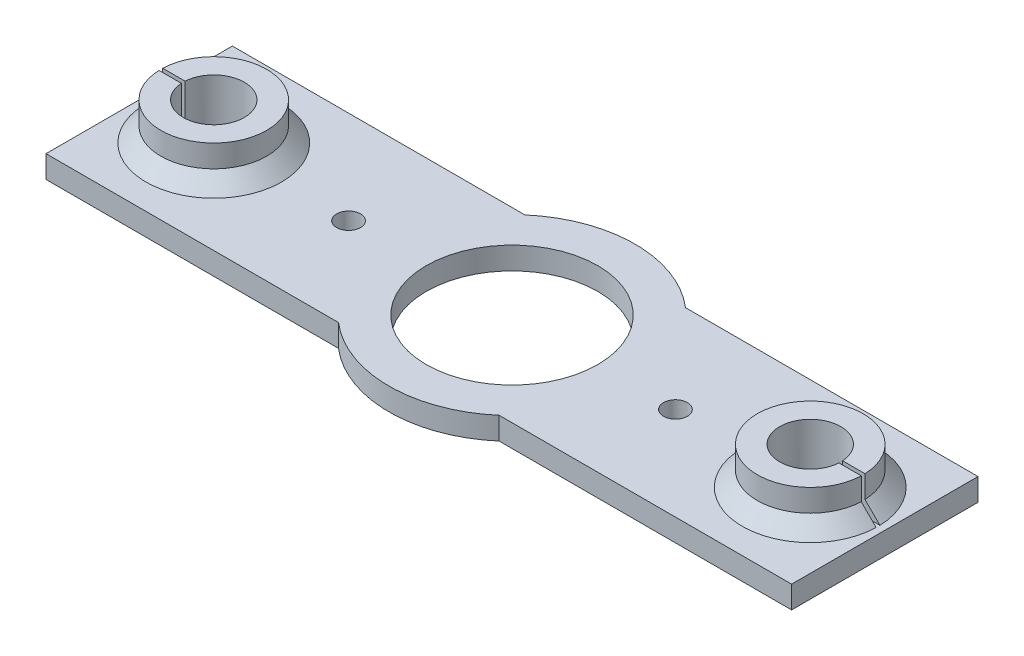
ISO-10303-21;
HEADER;
FILE_DESCRIPTION(('STEP AP214'),'2;1');
FILE_NAME('part.step','',(''),(''),'','','');
FILE_SCHEMA(('AUTOMOTIVE_DESIGN { 1 0 10303 214 1 1 1 1 }'));
ENDSEC;
DATA;
#1=APPLICATION_CONTEXT('core data for automotive mechanical design processes');
#2=APPLICATION_PROTOCOL_DEFINITION('international standard','automotive_design',2000,#1);
#3=PRODUCT_CONTEXT('',#1,'mechanical');
#4=PRODUCT('Part','Part','',(#3));
#5=PRODUCT_RELATED_PRODUCT_CATEGORY('part','',(#4));
#6=PRODUCT_DEFINITION_FORMATION('','',#4);
#7=PRODUCT_DEFINITION_CONTEXT('part definition',#1,'design');
#8=PRODUCT_DEFINITION('design','',#6,#7);
#9=PRODUCT_DEFINITION_SHAPE('','',#8);
#10=(LENGTH_UNIT() NAMED_UNIT(*) SI_UNIT(.MILLI.,.METRE.));
#11=(NAMED_UNIT(*) PLANE_ANGLE_UNIT() SI_UNIT($,.RADIAN.));
#12=(NAMED_UNIT(*) SI_UNIT($,.STERADIAN.) SOLID_ANGLE_UNIT());
#13=UNCERTAINTY_MEASURE_WITH_UNIT(LENGTH_MEASURE(1.E-05),#10,'distance_accuracy_value','');
#14=(GEOMETRIC_REPRESENTATION_CONTEXT(3) GLOBAL_UNCERTAINTY_ASSIGNED_CONTEXT((#13)) GLOBAL_UNIT_ASSIGNED_CONTEXT((#10,
#11,#12)) REPRESENTATION_CONTEXT('',''));
#15=CARTESIAN_POINT('',(0.,0.,0.));
#16=DIRECTION('',(0.,0.,1.));
#17=DIRECTION('',(1.,0.,0.));
#18=AXIS2_PLACEMENT_3D('',#15,#16,#17);
#19=CARTESIAN_POINT('',(0.,3.,12.5));
#20=DIRECTION('',(0.,0.,1.));
#21=DIRECTION('',(1.,0.,0.));
#22=AXIS2_PLACEMENT_3D('',#19,#20,#21);
#23=PLANE('',#22);
#24=DIRECTION('',(-1.,0.,0.));
#25=VECTOR('',#24,1.);
#26=CARTESIAN_POINT('',(0.,0.,12.5));
#27=LINE('',#26,#25);
#28=CARTESIAN_POINT('',(-10.770329614269,0.,12.5));
#29=VERTEX_POINT('',#28);
#30=CARTESIAN_POINT('',(-50.,0.,12.5));
#31=VERTEX_POINT('',#30);
#32=EDGE_CURVE('E228',#29,#31,#27,.T.);
#33=ORIENTED_EDGE('',*,*,#32,.F.);
#34=DIRECTION('',(0.,-1.,0.));
#35=VECTOR('',#34,1.);
#36=CARTESIAN_POINT('',(-10.770329614269,3.,12.5));
#37=LINE('',#36,#35);
#38=CARTESIAN_POINT('',(-10.770329614269,3.,12.5));
#39=VERTEX_POINT('',#38);
#40=EDGE_CURVE('E315',#39,#29,#37,.T.);
#41=ORIENTED_EDGE('',*,*,#40,.F.);
#42=DIRECTION('',(-1.,0.,0.));
#43=VECTOR('',#42,1.);
#44=CARTESIAN_POINT('',(0.,3.,12.5));
#45=LINE('',#44,#43);
#46=CARTESIAN_POINT('',(-50.,3.,12.5));
#47=VERTEX_POINT('',#46);
#48=EDGE_CURVE('E229',#39,#47,#45,.T.);
#49=ORIENTED_EDGE('',*,*,#48,.T.);
#50=DIRECTION('',(0.,-1.,0.));
#51=VECTOR('',#50,1.);
#52=CARTESIAN_POINT('',(-50.,3.,12.5));
#53=LINE('',#52,#51);
#54=EDGE_CURVE('E264',#47,#31,#53,.T.);
#55=ORIENTED_EDGE('',*,*,#54,.T.);
#56=EDGE_LOOP('',(#33,#41,#49,#55));
#57=FACE_BOUND('',#56,.T.);
#58=ADVANCED_FACE('F35',(#57),#23,.T.);
#59=CARTESIAN_POINT('',(0.,3.,0.));
#60=DIRECTION('',(0.,-1.,0.));
#61=DIRECTION('',(0.,0.,-1.));
#62=AXIS2_PLACEMENT_3D('',#59,#60,#61);
#63=CYLINDRICAL_SURFACE('',#62,16.5);
#64=CARTESIAN_POINT('',(0.,0.,0.));
#65=DIRECTION('',(0.,1.,0.));
#66=DIRECTION('',(0.,0.,1.));
#67=AXIS2_PLACEMENT_3D('',#64,#65,#66);
#68=CIRCLE('',#67,16.5);
#69=CARTESIAN_POINT('',(10.770329614269,0.,12.5));
#70=VERTEX_POINT('',#69);
#71=EDGE_CURVE('E267',#29,#70,#68,.T.);
#72=ORIENTED_EDGE('',*,*,#71,.T.);
#73=DIRECTION('',(0.,-1.,0.));
#74=VECTOR('',#73,1.);
#75=CARTESIAN_POINT('',(10.770329614269,3.,12.5));
#76=LINE('',#75,#74);
#77=CARTESIAN_POINT('',(10.770329614269,3.,12.5));
#78=VERTEX_POINT('',#77);
#79=EDGE_CURVE('E313',#78,#70,#76,.T.);
#80=ORIENTED_EDGE('',*,*,#79,.F.);
#81=CARTESIAN_POINT('',(0.,3.,0.));
#82=DIRECTION('',(0.,1.,0.));
#83=DIRECTION('',(0.,0.,1.));
#84=AXIS2_PLACEMENT_3D('',#81,#82,#83);
#85=CIRCLE('',#84,16.5);
#86=EDGE_CURVE('E232',#39,#78,#85,.T.);
#87=ORIENTED_EDGE('',*,*,#86,.F.);
#88=ORIENTED_EDGE('',*,*,#40,.T.);
#89=EDGE_LOOP('',(#72,#80,#87,#88));
#90=FACE_BOUND('',#89,.T.);
#91=ADVANCED_FACE('F348',(#90),#63,.T.);
#92=CARTESIAN_POINT('',(0.,3.,12.5));
#93=DIRECTION('',(0.,0.,1.));
#94=DIRECTION('',(1.,0.,0.));
#95=AXIS2_PLACEMENT_3D('',#92,#93,#94);
#96=PLANE('',#95);
#97=DIRECTION('',(-1.,0.,0.));
#98=VECTOR('',#97,1.);
#99=CARTESIAN_POINT('',(0.,0.,12.5));
#100=LINE('',#99,#98);
#101=CARTESIAN_POINT('',(50.,0.,12.5));
#102=VERTEX_POINT('',#101);
#103=EDGE_CURVE('E270',#102,#70,#100,.T.);
#104=ORIENTED_EDGE('',*,*,#103,.F.);
#105=DIRECTION('',(0.,-1.,0.));
#106=VECTOR('',#105,1.);
#107=CARTESIAN_POINT('',(50.,3.,12.5));
#108=LINE('',#107,#106);
#109=CARTESIAN_POINT('',(50.,3.,12.5));
#110=VERTEX_POINT('',#109);
#111=EDGE_CURVE('E311',#110,#102,#108,.T.);
#112=ORIENTED_EDGE('',*,*,#111,.F.);
#113=DIRECTION('',(-1.,0.,0.));
#114=VECTOR('',#113,1.);
#115=CARTESIAN_POINT('',(0.,3.,12.5));
#116=LINE('',#115,#114);
#117=EDGE_CURVE('E235',#110,#78,#116,.T.);
#118=ORIENTED_EDGE('',*,*,#117,.T.);
#119=ORIENTED_EDGE('',*,*,#79,.T.);
#120=EDGE_LOOP('',(#104,#112,#118,#119));
#121=FACE_BOUND('',#120,.T.);
#122=ADVANCED_FACE('F352',(#121),#96,.T.);
#123=CARTESIAN_POINT('',(50.,3.,0.));
#124=DIRECTION('',(-1.,0.,0.));
#125=DIRECTION('',(0.,0.,1.));
#126=AXIS2_PLACEMENT_3D('',#123,#124,#125);
#127=PLANE('',#126);
#128=DIRECTION('',(0.,0.,-1.));
#129=VECTOR('',#128,1.);
#130=CARTESIAN_POINT('',(50.,0.,0.));
#131=LINE('',#130,#129);
#132=CARTESIAN_POINT('',(50.,0.,-12.5));
#133=VERTEX_POINT('',#132);
#134=EDGE_CURVE('E273',#102,#133,#131,.T.);
#135=ORIENTED_EDGE('',*,*,#134,.T.);
#136=DIRECTION('',(0.,-1.,0.));
#137=VECTOR('',#136,1.);
#138=CARTESIAN_POINT('',(50.,3.,-12.5));
#139=LINE('',#138,#137);
#140=CARTESIAN_POINT('',(50.,3.,-12.5));
#141=VERTEX_POINT('',#140);
#142=EDGE_CURVE('E308',#141,#133,#139,.T.);
#143=ORIENTED_EDGE('',*,*,#142,.F.);
#144=DIRECTION('',(0.,0.,-1.));
#145=VECTOR('',#144,1.);
#146=CARTESIAN_POINT('',(50.,3.,0.));
#147=LINE('',#146,#145);
#148=EDGE_CURVE('E238',#110,#141,#147,.T.);
#149=ORIENTED_EDGE('',*,*,#148,.F.);
#150=ORIENTED_EDGE('',*,*,#111,.T.);
#151=EDGE_LOOP('',(#135,#143,#149,#150));
#152=FACE_BOUND('',#151,.T.);
#153=ADVANCED_FACE('F356',(#152),#127,.F.);
#154=CARTESIAN_POINT('',(0.,3.,-12.5));
#155=DIRECTION('',(0.,0.,1.));
#156=DIRECTION('',(1.,0.,0.));
#157=AXIS2_PLACEMENT_3D('',#154,#155,#156);
#158=PLANE('',#157);
#159=DIRECTION('',(-1.,0.,0.));
#160=VECTOR('',#159,1.);
#161=CARTESIAN_POINT('',(0.,0.,-12.5));
#162=LINE('',#161,#160);
#163=CARTESIAN_POINT('',(10.770329614269,0.,-12.5));
#164=VERTEX_POINT('',#163);
#165=EDGE_CURVE('E275',#133,#164,#162,.T.);
#166=ORIENTED_EDGE('',*,*,#165,.T.);
#167=DIRECTION('',(0.,-1.,0.));
#168=VECTOR('',#167,1.);
#169=CARTESIAN_POINT('',(10.770329614269,3.,-12.5));
#170=LINE('',#169,#168);
#171=CARTESIAN_POINT('',(10.770329614269,3.,-12.5));
#172=VERTEX_POINT('',#171);
#173=EDGE_CURVE('E305',#172,#164,#170,.T.);
#174=ORIENTED_EDGE('',*,*,#173,.F.);
#175=DIRECTION('',(-1.,0.,0.));
#176=VECTOR('',#175,1.);
#177=CARTESIAN_POINT('',(0.,3.,-12.5));
#178=LINE('',#177,#176);
#179=EDGE_CURVE('E240',#141,#172,#178,.T.);
#180=ORIENTED_EDGE('',*,*,#179,.F.);
#181=ORIENTED_EDGE('',*,*,#142,.T.);
#182=EDGE_LOOP('',(#166,#174,#180,#181));
#183=FACE_BOUND('',#182,.T.);
#184=ADVANCED_FACE('F360',(#183),#158,.F.);
#185=CARTESIAN_POINT('',(0.,3.,0.));
#186=DIRECTION('',(0.,-1.,0.));
#187=DIRECTION('',(0.,0.,-1.));
#188=AXIS2_PLACEMENT_3D('',#185,#186,#187);
#189=CYLINDRICAL_SURFACE('',#188,16.5);
#190=CARTESIAN_POINT('',(0.,0.,0.));
#191=DIRECTION('',(0.,1.,0.));
#192=DIRECTION('',(0.,0.,1.));
#193=AXIS2_PLACEMENT_3D('',#190,#191,#192);
#194=CIRCLE('',#193,16.5);
#195=CARTESIAN_POINT('',(-10.770329614269,0.,-12.5));
#196=VERTEX_POINT('',#195);
#197=EDGE_CURVE('E277',#164,#196,#194,.T.);
#198=ORIENTED_EDGE('',*,*,#197,.T.);
#199=DIRECTION('',(0.,-1.,0.));
#200=VECTOR('',#199,1.);
#201=CARTESIAN_POINT('',(-10.770329614269,3.,-12.5));
#202=LINE('',#201,#200);
#203=CARTESIAN_POINT('',(-10.770329614269,3.,-12.5));
#204=VERTEX_POINT('',#203);
#205=EDGE_CURVE('E302',#204,#196,#202,.T.);
#206=ORIENTED_EDGE('',*,*,#205,.F.);
#207=CARTESIAN_POINT('',(0.,3.,0.));
#208=DIRECTION('',(0.,1.,0.));
#209=DIRECTION('',(0.,0.,1.));
#210=AXIS2_PLACEMENT_3D('',#207,#208,#209);
#211=CIRCLE('',#210,16.5);
#212=EDGE_CURVE('E242',#172,#204,#211,.T.);
#213=ORIENTED_EDGE('',*,*,#212,.F.);
#214=ORIENTED_EDGE('',*,*,#173,.T.);
#215=EDGE_LOOP('',(#198,#206,#213,#214));
#216=FACE_BOUND('',#215,.T.);
#217=ADVANCED_FACE('F364',(#216),#189,.T.);
#218=CARTESIAN_POINT('',(0.,3.,-12.5));
#219=DIRECTION('',(0.,0.,1.));
#220=DIRECTION('',(1.,0.,0.));
#221=AXIS2_PLACEMENT_3D('',#218,#219,#220);
#222=PLANE('',#221);
#223=DIRECTION('',(-1.,0.,0.));
#224=VECTOR('',#223,1.);
#225=CARTESIAN_POINT('',(0.,0.,-12.5));
#226=LINE('',#225,#224);
#227=CARTESIAN_POINT('',(-50.,0.,-12.5));
#228=VERTEX_POINT('',#227);
#229=EDGE_CURVE('E279',#196,#228,#226,.T.);
#230=ORIENTED_EDGE('',*,*,#229,.T.);
#231=DIRECTION('',(0.,-1.,0.));
#232=VECTOR('',#231,1.);
#233=CARTESIAN_POINT('',(-50.,3.,-12.5));
#234=LINE('',#233,#232);
#235=CARTESIAN_POINT('',(-50.,3.,-12.5));
#236=VERTEX_POINT('',#235);
#237=EDGE_CURVE('E300',#236,#228,#234,.T.);
#238=ORIENTED_EDGE('',*,*,#237,.F.);
#239=DIRECTION('',(-1.,0.,0.));
#240=VECTOR('',#239,1.);
#241=CARTESIAN_POINT('',(0.,3.,-12.5));
#242=LINE('',#241,#240);
#243=EDGE_CURVE('E244',#204,#236,#242,.T.);
#244=ORIENTED_EDGE('',*,*,#243,.F.);
#245=ORIENTED_EDGE('',*,*,#205,.T.);
#246=EDGE_LOOP('',(#230,#238,#244,#245));
#247=FACE_BOUND('',#246,.T.);
#248=ADVANCED_FACE('F368',(#247),#222,.F.);
#249=CARTESIAN_POINT('',(21.92,3.,0.));
#250=DIRECTION('',(0.,-1.,0.));
#251=DIRECTION('',(0.,0.,-1.));
#252=AXIS2_PLACEMENT_3D('',#249,#250,#251);
#253=CYLINDRICAL_SURFACE('',#252,1.6);
#254=CARTESIAN_POINT('',(21.92,3.,0.));
#255=DIRECTION('',(0.,1.,0.));
#256=DIRECTION('',(0.,0.,1.));
#257=AXIS2_PLACEMENT_3D('',#254,#255,#256);
#258=CIRCLE('',#257,1.6);
#259=CARTESIAN_POINT('',(21.92,3.,1.6));
#260=VERTEX_POINT('',#259);
#261=EDGE_CURVE('E258',#260,#260,#258,.F.);
#262=ORIENTED_EDGE('',*,*,#261,.F.);
#263=EDGE_LOOP('',(#262));
#264=FACE_BOUND('',#263,.T.);
#265=CARTESIAN_POINT('',(21.92,0.,0.));
#266=DIRECTION('',(0.,1.,0.));
#267=DIRECTION('',(0.,0.,1.));
#268=AXIS2_PLACEMENT_3D('',#265,#266,#267);
#269=CIRCLE('',#268,1.6);
#270=CARTESIAN_POINT('',(21.92,0.,1.6));
#271=VERTEX_POINT('',#270);
#272=EDGE_CURVE('E294',#271,#271,#269,.F.);
#273=ORIENTED_EDGE('',*,*,#272,.T.);
#274=EDGE_LOOP('',(#273));
#275=FACE_BOUND('',#274,.T.);
#276=ADVANCED_FACE('F372',(#264,#275),#253,.F.);
#277=CARTESIAN_POINT('',(0.,3.,0.));
#278=DIRECTION('',(0.,-1.,0.));
#279=DIRECTION('',(0.,0.,-1.));
#280=AXIS2_PLACEMENT_3D('',#277,#278,#279);
#281=CYLINDRICAL_SURFACE('',#280,11.5);
#282=CARTESIAN_POINT('',(0.,3.,0.));
#283=DIRECTION('',(0.,1.,0.));
#284=DIRECTION('',(0.,0.,1.));
#285=AXIS2_PLACEMENT_3D('',#282,#283,#284);
#286=CIRCLE('',#285,11.5);
#287=CARTESIAN_POINT('',(0.,3.,11.5));
#288=VERTEX_POINT('',#287);
#289=EDGE_CURVE('E255',#288,#288,#286,.T.);
#290=ORIENTED_EDGE('',*,*,#289,.T.);
#291=EDGE_LOOP('',(#290));
#292=FACE_BOUND('',#291,.T.);
#293=CARTESIAN_POINT('',(0.,0.,0.));
#294=DIRECTION('',(0.,1.,0.));
#295=DIRECTION('',(0.,0.,1.));
#296=AXIS2_PLACEMENT_3D('',#293,#294,#295);
#297=CIRCLE('',#296,11.5);
#298=CARTESIAN_POINT('',(0.,0.,11.5));
#299=VERTEX_POINT('',#298);
#300=EDGE_CURVE('E291',#299,#299,#297,.T.);
#301=ORIENTED_EDGE('',*,*,#300,.F.);
#302=EDGE_LOOP('',(#301));
#303=FACE_BOUND('',#302,.T.);
#304=ADVANCED_FACE('F386',(#292,#303),#281,.F.);
#305=CARTESIAN_POINT('',(-21.92,3.,0.));
#306=DIRECTION('',(0.,-1.,0.));
#307=DIRECTION('',(0.,0.,-1.));
#308=AXIS2_PLACEMENT_3D('',#305,#306,#307);
#309=CYLINDRICAL_SURFACE('',#308,1.6);
#310=CARTESIAN_POINT('',(-21.92,3.,0.));
#311=DIRECTION('',(0.,1.,0.));
#312=DIRECTION('',(0.,0.,1.));
#313=AXIS2_PLACEMENT_3D('',#310,#311,#312);
#314=CIRCLE('',#313,1.6);
#315=CARTESIAN_POINT('',(-21.92,3.,1.6));
#316=VERTEX_POINT('',#315);
#317=EDGE_CURVE('E252',#316,#316,#314,.T.);
#318=ORIENTED_EDGE('',*,*,#317,.T.);
#319=EDGE_LOOP('',(#318));
#320=FACE_BOUND('',#319,.T.);
#321=CARTESIAN_POINT('',(-21.92,0.,0.));
#322=DIRECTION('',(0.,1.,0.));
#323=DIRECTION('',(0.,0.,1.));
#324=AXIS2_PLACEMENT_3D('',#321,#322,#323);
#325=CIRCLE('',#324,1.6);
#326=CARTESIAN_POINT('',(-21.92,0.,1.6));
#327=VERTEX_POINT('',#326);
#328=EDGE_CURVE('E288',#327,#327,#325,.T.);
#329=ORIENTED_EDGE('',*,*,#328,.F.);
#330=EDGE_LOOP('',(#329));
#331=FACE_BOUND('',#330,.T.);
#332=ADVANCED_FACE('F382',(#320,#331),#309,.F.);
#333=CARTESIAN_POINT('',(-40.,3.,0.));
#334=DIRECTION('',(0.,-1.,0.));
#335=DIRECTION('',(0.,0.,-1.));
#336=AXIS2_PLACEMENT_3D('',#333,#334,#335);
#337=CYLINDRICAL_SURFACE('',#336,4.1);
#338=CARTESIAN_POINT('',(-40.,3.,0.));
#339=DIRECTION('',(0.,1.,0.));
#340=DIRECTION('',(0.,0.,1.));
#341=AXIS2_PLACEMENT_3D('',#338,#339,#340);
#342=CIRCLE('',#341,4.1);
#343=CARTESIAN_POINT('',(-44.0923709509281,3.,-0.249999999999995));
#344=VERTEX_POINT('',#343);
#345=CARTESIAN_POINT('',(-44.0923709509281,3.,0.250000000000006));
#346=VERTEX_POINT('',#345);
#347=EDGE_CURVE('E249',#344,#346,#342,.T.);
#348=ORIENTED_EDGE('',*,*,#347,.T.);
#349=DIRECTION('',(0.,-1.,0.));
#350=VECTOR('',#349,1.);
#351=CARTESIAN_POINT('',(-44.0923709509281,8.,0.250000000000006));
#352=LINE('',#351,#350);
#353=CARTESIAN_POINT('',(-44.0923709509281,8.,0.250000000000006));
#354=VERTEX_POINT('',#353);
#355=EDGE_CURVE('E215',#354,#346,#352,.T.);
#356=ORIENTED_EDGE('',*,*,#355,.F.);
#357=CARTESIAN_POINT('',(-40.,8.,0.));
#358=DIRECTION('',(0.,1.,0.));
#359=DIRECTION('',(0.,0.,1.));
#360=AXIS2_PLACEMENT_3D('',#357,#358,#359);
#361=CIRCLE('',#360,4.1);
#362=CARTESIAN_POINT('',(-44.0923709509281,8.,-0.249999999999995));
#363=VERTEX_POINT('',#362);
#364=EDGE_CURVE('E213',#363,#354,#361,.F.);
#365=ORIENTED_EDGE('',*,*,#364,.F.);
#366=DIRECTION('',(0.,-1.,0.));
#367=VECTOR('',#366,1.);
#368=CARTESIAN_POINT('',(-44.0923709509281,8.,-0.249999999999995));
#369=LINE('',#368,#367);
#370=EDGE_CURVE('E220',#363,#344,#369,.T.);
#371=ORIENTED_EDGE('',*,*,#370,.T.);
#372=EDGE_LOOP('',(#348,#356,#365,#371));
#373=FACE_BOUND('',#372,.T.);
#374=CARTESIAN_POINT('',(-40.,0.,0.));
#375=DIRECTION('',(0.,1.,0.));
#376=DIRECTION('',(0.,0.,1.));
#377=AXIS2_PLACEMENT_3D('',#374,#375,#376);
#378=CIRCLE('',#377,4.1);
#379=CARTESIAN_POINT('',(-40.,0.,4.1));
#380=VERTEX_POINT('',#379);
#381=EDGE_CURVE('E285',#380,#380,#378,.T.);
#382=ORIENTED_EDGE('',*,*,#381,.F.);
#383=EDGE_LOOP('',(#382));
#384=FACE_BOUND('',#383,.T.);
#385=ADVANCED_FACE('F378',(#373,#384),#337,.F.);
#386=CARTESIAN_POINT('',(-50.,3.,0.));
#387=DIRECTION('',(-1.,0.,0.));
#388=DIRECTION('',(0.,0.,1.));
#389=AXIS2_PLACEMENT_3D('',#386,#387,#388);
#390=PLANE('',#389);
#391=DIRECTION('',(0.,0.,-1.));
#392=VECTOR('',#391,1.);
#393=CARTESIAN_POINT('',(-50.,0.,0.));
#394=LINE('',#393,#392);
#395=EDGE_CURVE('E282',#31,#228,#394,.T.);
#396=ORIENTED_EDGE('',*,*,#395,.F.);
#397=ORIENTED_EDGE('',*,*,#54,.F.);
#398=DIRECTION('',(0.,0.,-1.));
#399=VECTOR('',#398,1.);
#400=CARTESIAN_POINT('',(-50.,3.,0.));
#401=LINE('',#400,#399);
#402=EDGE_CURVE('E246',#47,#236,#401,.T.);
#403=ORIENTED_EDGE('',*,*,#402,.T.);
#404=ORIENTED_EDGE('',*,*,#237,.T.);
#405=EDGE_LOOP('',(#396,#397,#403,#404));
#406=FACE_BOUND('',#405,.T.);
#407=ADVANCED_FACE('F374',(#406),#390,.T.);
#408=CARTESIAN_POINT('',(40.,3.,0.));
#409=DIRECTION('',(0.,-1.,0.));
#410=DIRECTION('',(0.,0.,-1.));
#411=AXIS2_PLACEMENT_3D('',#408,#409,#410);
#412=CYLINDRICAL_SURFACE('',#411,4.1);
#413=CARTESIAN_POINT('',(40.,3.,0.));
#414=DIRECTION('',(0.,1.,0.));
#415=DIRECTION('',(0.,0.,1.));
#416=AXIS2_PLACEMENT_3D('',#413,#414,#415);
#417=CIRCLE('',#416,4.1);
#418=CARTESIAN_POINT('',(44.0923709509281,3.,-0.250000000000006));
#419=VERTEX_POINT('',#418);
#420=CARTESIAN_POINT('',(44.0923709509281,3.,0.249999999999995));
#421=VERTEX_POINT('',#420);
#422=EDGE_CURVE('E261',#419,#421,#417,.F.);
#423=ORIENTED_EDGE('',*,*,#422,.F.);
#424=DIRECTION('',(0.,-1.,0.));
#425=VECTOR('',#424,1.);
#426=CARTESIAN_POINT('',(44.0923709509281,8.,-0.250000000000006));
#427=LINE('',#426,#425);
#428=CARTESIAN_POINT('',(44.0923709509281,8.,-0.250000000000006));
#429=VERTEX_POINT('',#428);
#430=EDGE_CURVE('E201',#429,#419,#427,.T.);
#431=ORIENTED_EDGE('',*,*,#430,.F.);
#432=CARTESIAN_POINT('',(40.,8.,0.));
#433=DIRECTION('',(0.,1.,0.));
#434=DIRECTION('',(0.,0.,1.));
#435=AXIS2_PLACEMENT_3D('',#432,#433,#434);
#436=CIRCLE('',#435,4.1);
#437=CARTESIAN_POINT('',(44.0923709509281,8.,0.249999999999995));
#438=VERTEX_POINT('',#437);
#439=EDGE_CURVE('E191',#438,#429,#436,.F.);
#440=ORIENTED_EDGE('',*,*,#439,.F.);
#441=DIRECTION('',(0.,-1.,0.));
#442=VECTOR('',#441,1.);
#443=CARTESIAN_POINT('',(44.0923709509281,8.,0.249999999999995));
#444=LINE('',#443,#442);
#445=EDGE_CURVE('E177',#438,#421,#444,.T.);
#446=ORIENTED_EDGE('',*,*,#445,.T.);
#447=EDGE_LOOP('',(#423,#431,#440,#446));
#448=FACE_BOUND('',#447,.T.);
#449=CARTESIAN_POINT('',(40.,0.,0.));
#450=DIRECTION('',(0.,1.,0.));
#451=DIRECTION('',(0.,0.,1.));
#452=AXIS2_PLACEMENT_3D('',#449,#450,#451);
#453=CIRCLE('',#452,4.1);
#454=CARTESIAN_POINT('',(40.,0.,4.09999999999999));
#455=VERTEX_POINT('',#454);
#456=EDGE_CURVE('E233',#455,#455,#453,.F.);
#457=ORIENTED_EDGE('',*,*,#456,.T.);
#458=EDGE_LOOP('',(#457));
#459=FACE_BOUND('',#458,.T.);
#460=ADVANCED_FACE('F377',(#448,#459),#412,.F.);
#461=CARTESIAN_POINT('',(0.,3.,0.));
#462=DIRECTION('',(0.,1.,0.));
#463=DIRECTION('',(0.,0.,1.));
#464=AXIS2_PLACEMENT_3D('',#461,#462,#463);
#465=PLANE('',#464);
#466=CARTESIAN_POINT('',(40.,3.,0.));
#467=DIRECTION('',(0.,1.,0.));
#468=DIRECTION('',(0.,0.,1.));
#469=AXIS2_PLACEMENT_3D('',#466,#467,#468);
#470=CIRCLE('',#469,9.09754007086546);
#471=CARTESIAN_POINT('',(49.09410442765,3.,0.249999999999994));
#472=VERTEX_POINT('',#471);
#473=CARTESIAN_POINT('',(49.09410442765,3.,-0.250000000000006));
#474=VERTEX_POINT('',#473);
#475=EDGE_CURVE('E320',#472,#474,#470,.F.);
#476=ORIENTED_EDGE('',*,*,#475,.T.);
#477=DIRECTION('',(1.,0.,0.));
#478=VECTOR('',#477,1.);
#479=CARTESIAN_POINT('',(0.,3.,-0.250000000000003));
#480=LINE('',#479,#478);
#481=EDGE_CURVE('E186',#419,#474,#480,.T.);
#482=ORIENTED_EDGE('',*,*,#481,.F.);
#483=ORIENTED_EDGE('',*,*,#422,.T.);
#484=DIRECTION('',(1.,0.,0.));
#485=VECTOR('',#484,1.);
#486=CARTESIAN_POINT('',(0.,3.,0.250000000000002));
#487=LINE('',#486,#485);
#488=EDGE_CURVE('E197',#421,#472,#487,.T.);
#489=ORIENTED_EDGE('',*,*,#488,.T.);
#490=EDGE_LOOP('',(#476,#482,#483,#489));
#491=FACE_BOUND('',#490,.T.);
#492=DIRECTION('',(-1.,0.,0.));
#493=VECTOR('',#492,1.);
#494=CARTESIAN_POINT('',(0.,3.,-0.25));
#495=LINE('',#494,#493);
#496=CARTESIAN_POINT('',(-49.0941044276499,3.,-0.249999999999994));
#497=VERTEX_POINT('',#496);
#498=EDGE_CURVE('E208',#344,#497,#495,.T.);
#499=ORIENTED_EDGE('',*,*,#498,.T.);
#500=CARTESIAN_POINT('',(-40.,3.,0.));
#501=DIRECTION('',(0.,1.,0.));
#502=DIRECTION('',(0.,0.,1.));
#503=AXIS2_PLACEMENT_3D('',#500,#501,#502);
#504=CIRCLE('',#503,9.09754007086541);
#505=CARTESIAN_POINT('',(-49.0941044276499,3.,0.250000000000006));
#506=VERTEX_POINT('',#505);
#507=EDGE_CURVE('E317',#497,#506,#504,.F.);
#508=ORIENTED_EDGE('',*,*,#507,.T.);
#509=DIRECTION('',(-1.,0.,0.));
#510=VECTOR('',#509,1.);
#511=CARTESIAN_POINT('',(0.,3.,0.250000000000001));
#512=LINE('',#511,#510);
#513=EDGE_CURVE('E176',#346,#506,#512,.T.);
#514=ORIENTED_EDGE('',*,*,#513,.F.);
#515=ORIENTED_EDGE('',*,*,#347,.F.);
#516=EDGE_LOOP('',(#499,#508,#514,#515));
#517=FACE_BOUND('',#516,.T.);
#518=ORIENTED_EDGE('',*,*,#48,.F.);
#519=ORIENTED_EDGE('',*,*,#86,.T.);
#520=ORIENTED_EDGE('',*,*,#117,.F.);
#521=ORIENTED_EDGE('',*,*,#148,.T.);
#522=ORIENTED_EDGE('',*,*,#179,.T.);
#523=ORIENTED_EDGE('',*,*,#212,.T.);
#524=ORIENTED_EDGE('',*,*,#243,.T.);
#525=ORIENTED_EDGE('',*,*,#402,.F.);
#526=EDGE_LOOP('',(#518,#519,#520,#521,#522,#523,#524,#525));
#527=FACE_BOUND('',#526,.T.);
#528=ORIENTED_EDGE('',*,*,#317,.F.);
#529=EDGE_LOOP('',(#528));
#530=FACE_BOUND('',#529,.T.);
#531=ORIENTED_EDGE('',*,*,#289,.F.);
#532=EDGE_LOOP('',(#531));
#533=FACE_BOUND('',#532,.T.);
#534=ORIENTED_EDGE('',*,*,#261,.T.);
#535=EDGE_LOOP('',(#534));
#536=FACE_BOUND('',#535,.T.);
#537=ADVANCED_FACE('F396',(#491,#517,#527,#530,#533,#536),#465,.T.);
#538=CARTESIAN_POINT('',(0.,0.,0.));
#539=DIRECTION('',(0.,1.,0.));
#540=DIRECTION('',(0.,0.,1.));
#541=AXIS2_PLACEMENT_3D('',#538,#539,#540);
#542=PLANE('',#541);
#543=ORIENTED_EDGE('',*,*,#32,.T.);
#544=ORIENTED_EDGE('',*,*,#395,.T.);
#545=ORIENTED_EDGE('',*,*,#229,.F.);
#546=ORIENTED_EDGE('',*,*,#197,.F.);
#547=ORIENTED_EDGE('',*,*,#165,.F.);
#548=ORIENTED_EDGE('',*,*,#134,.F.);
#549=ORIENTED_EDGE('',*,*,#103,.T.);
#550=ORIENTED_EDGE('',*,*,#71,.F.);
#551=EDGE_LOOP('',(#543,#544,#545,#546,#547,#548,#549,#550));
#552=FACE_BOUND('',#551,.T.);
#553=ORIENTED_EDGE('',*,*,#381,.T.);
#554=EDGE_LOOP('',(#553));
#555=FACE_BOUND('',#554,.T.);
#556=ORIENTED_EDGE('',*,*,#328,.T.);
#557=EDGE_LOOP('',(#556));
#558=FACE_BOUND('',#557,.T.);
#559=ORIENTED_EDGE('',*,*,#300,.T.);
#560=EDGE_LOOP('',(#559));
#561=FACE_BOUND('',#560,.T.);
#562=ORIENTED_EDGE('',*,*,#272,.F.);
#563=EDGE_LOOP('',(#562));
#564=FACE_BOUND('',#563,.T.);
#565=ORIENTED_EDGE('',*,*,#456,.F.);
#566=EDGE_LOOP('',(#565));
#567=FACE_BOUND('',#566,.T.);
#568=ADVANCED_FACE('F398',(#552,#555,#558,#561,#564,#567),#542,.F.);
#569=CARTESIAN_POINT('',(0.,8.,0.250000000000001));
#570=DIRECTION('',(0.,0.,1.));
#571=DIRECTION('',(1.,0.,0.));
#572=AXIS2_PLACEMENT_3D('',#569,#570,#571);
#573=PLANE('',#572);
#574=ORIENTED_EDGE('',*,*,#513,.T.);
#575=CARTESIAN_POINT('',(-49.0941044276499,3.,0.250000000000006));
#576=CARTESIAN_POINT('',(-48.7606295935804,3.33335328505449,0.250000000000006));
#577=CARTESIAN_POINT('',(-48.4271447884612,3.66669659422999,0.250000000000006));
#578=CARTESIAN_POINT('',(-47.7601552360495,4.33336326089666,0.250000000000006));
#579=CARTESIAN_POINT('',(-47.4266504887571,4.66668661838782,0.250000000000006));
#580=CARTESIAN_POINT('',(-47.093135770415,4.99999999999999,0.250000000000006));
#581=B_SPLINE_CURVE_WITH_KNOTS('',3,(#575,#576,#577,#578,#579,#580),.UNSPECIFIED.,.F.,.F.,(4,2,
4),(0.,1.41455607635659,2.82911215302581),.UNSPECIFIED.);
#582=CARTESIAN_POINT('',(-47.093135770415,4.99999999999999,0.250000000000006));
#583=VERTEX_POINT('',#582);
#584=EDGE_CURVE('E11',#506,#583,#581,.T.);
#585=ORIENTED_EDGE('',*,*,#584,.T.);
#586=DIRECTION('',(0.,-1.,0.));
#587=VECTOR('',#586,1.);
#588=CARTESIAN_POINT('',(-47.093135770415,8.,0.250000000000006));
#589=LINE('',#588,#587);
#590=CARTESIAN_POINT('',(-47.093135770415,8.,0.250000000000006));
#591=VERTEX_POINT('',#590);
#592=EDGE_CURVE('E226',#591,#583,#589,.T.);
#593=ORIENTED_EDGE('',*,*,#592,.F.);
#594=DIRECTION('',(-1.,0.,0.));
#595=VECTOR('',#594,1.);
#596=CARTESIAN_POINT('',(0.,8.,0.250000000000001));
#597=LINE('',#596,#595);
#598=EDGE_CURVE('E204',#354,#591,#597,.T.);
#599=ORIENTED_EDGE('',*,*,#598,.F.);
#600=ORIENTED_EDGE('',*,*,#355,.T.);
#601=EDGE_LOOP('',(#574,#585,#593,#599,#600));
#602=FACE_BOUND('',#601,.T.);
#603=ADVANCED_FACE('F401',(#602),#573,.F.);
#604=CARTESIAN_POINT('',(-40.,8.,0.));
#605=DIRECTION('',(0.,-1.,0.));
#606=DIRECTION('',(0.,0.,-1.));
#607=AXIS2_PLACEMENT_3D('',#604,#605,#606);
#608=CYLINDRICAL_SURFACE('',#607,7.09754007086544);
#609=ORIENTED_EDGE('',*,*,#592,.T.);
#610=CARTESIAN_POINT('',(-40.,4.99999999999999,0.));
#611=DIRECTION('',(0.,1.,0.));
#612=DIRECTION('',(0.,0.,1.));
#613=AXIS2_PLACEMENT_3D('',#610,#611,#612);
#614=CIRCLE('',#613,7.09754007086544);
#615=CARTESIAN_POINT('',(-47.093135770415,4.99999999999999,-0.249999999999994));
#616=VERTEX_POINT('',#615);
#617=EDGE_CURVE('E324',#583,#616,#614,.T.);
#618=ORIENTED_EDGE('',*,*,#617,.T.);
#619=DIRECTION('',(0.,-1.,0.));
#620=VECTOR('',#619,1.);
#621=CARTESIAN_POINT('',(-47.093135770415,8.,-0.249999999999994));
#622=LINE('',#621,#620);
#623=CARTESIAN_POINT('',(-47.093135770415,8.,-0.249999999999994));
#624=VERTEX_POINT('',#623);
#625=EDGE_CURVE('E223',#624,#616,#622,.T.);
#626=ORIENTED_EDGE('',*,*,#625,.F.);
#627=CARTESIAN_POINT('',(-40.,8.,0.));
#628=DIRECTION('',(0.,1.,0.));
#629=DIRECTION('',(0.,0.,1.));
#630=AXIS2_PLACEMENT_3D('',#627,#628,#629);
#631=CIRCLE('',#630,7.09754007086544);
#632=EDGE_CURVE('E207',#591,#624,#631,.T.);
#633=ORIENTED_EDGE('',*,*,#632,.F.);
#634=EDGE_LOOP('',(#609,#618,#626,#633));
#635=FACE_BOUND('',#634,.T.);
#636=ADVANCED_FACE('F408',(#635),#608,.T.);
#637=CARTESIAN_POINT('',(0.,8.,-0.25));
#638=DIRECTION('',(0.,0.,1.));
#639=DIRECTION('',(1.,0.,0.));
#640=AXIS2_PLACEMENT_3D('',#637,#638,#639);
#641=PLANE('',#640);
#642=ORIENTED_EDGE('',*,*,#498,.F.);
#643=ORIENTED_EDGE('',*,*,#370,.F.);
#644=DIRECTION('',(-1.,0.,0.));
#645=VECTOR('',#644,1.);
#646=CARTESIAN_POINT('',(0.,8.,-0.25));
#647=LINE('',#646,#645);
#648=EDGE_CURVE('E210',#363,#624,#647,.T.);
#649=ORIENTED_EDGE('',*,*,#648,.T.);
#650=ORIENTED_EDGE('',*,*,#625,.T.);
#651=CARTESIAN_POINT('',(-47.093135770415,4.99999999999999,-0.249999999999994));
#652=CARTESIAN_POINT('',(-47.4266504887571,4.66668661838783,-0.249999999999994));
#653=CARTESIAN_POINT('',(-47.7601552360495,4.33336326089666,-0.249999999999994));
#654=CARTESIAN_POINT('',(-48.4271447884612,3.66669659422999,-0.249999999999994));
#655=CARTESIAN_POINT('',(-48.7606295935804,3.33335328505449,-0.249999999999994));
#656=CARTESIAN_POINT('',(-49.0941044276499,3.,-0.249999999999994));
#657=B_SPLINE_CURVE_WITH_KNOTS('',3,(#651,#652,#653,#654,#655,#656),.UNSPECIFIED.,.F.,.F.,(4,2,
4),(0.,1.41455607666922,2.82911215302581),.UNSPECIFIED.);
#658=EDGE_CURVE('E48',#616,#497,#657,.T.);
#659=ORIENTED_EDGE('',*,*,#658,.T.);
#660=EDGE_LOOP('',(#642,#643,#649,#650,#659));
#661=FACE_BOUND('',#660,.T.);
#662=ADVANCED_FACE('F411',(#661),#641,.T.);
#663=CARTESIAN_POINT('',(0.,8.,0.));
#664=DIRECTION('',(0.,1.,0.));
#665=DIRECTION('',(0.,0.,1.));
#666=AXIS2_PLACEMENT_3D('',#663,#664,#665);
#667=PLANE('',#666);
#668=ORIENTED_EDGE('',*,*,#598,.T.);
#669=ORIENTED_EDGE('',*,*,#632,.T.);
#670=ORIENTED_EDGE('',*,*,#648,.F.);
#671=ORIENTED_EDGE('',*,*,#364,.T.);
#672=EDGE_LOOP('',(#668,#669,#670,#671));
#673=FACE_BOUND('',#672,.T.);
#674=ADVANCED_FACE('F416',(#673),#667,.T.);
#675=CARTESIAN_POINT('',(40.,8.,0.));
#676=DIRECTION('',(0.,-1.,0.));
#677=DIRECTION('',(0.,0.,-1.));
#678=AXIS2_PLACEMENT_3D('',#675,#676,#677);
#679=CYLINDRICAL_SURFACE('',#678,7.09754007086545);
#680=DIRECTION('',(0.,-1.,0.));
#681=VECTOR('',#680,1.);
#682=CARTESIAN_POINT('',(47.093135770415,8.,-0.250000000000006));
#683=LINE('',#682,#681);
#684=CARTESIAN_POINT('',(47.093135770415,8.,-0.250000000000006));
#685=VERTEX_POINT('',#684);
#686=CARTESIAN_POINT('',(47.093135770415,4.99999999999999,-0.250000000000006));
#687=VERTEX_POINT('',#686);
#688=EDGE_CURVE('E196',#685,#687,#683,.T.);
#689=ORIENTED_EDGE('',*,*,#688,.T.);
#690=CARTESIAN_POINT('',(40.,4.99999999999999,0.));
#691=DIRECTION('',(0.,1.,0.));
#692=DIRECTION('',(0.,0.,1.));
#693=AXIS2_PLACEMENT_3D('',#690,#691,#692);
#694=CIRCLE('',#693,7.09754007086545);
#695=CARTESIAN_POINT('',(47.093135770415,4.99999999999999,0.249999999999994));
#696=VERTEX_POINT('',#695);
#697=EDGE_CURVE('E171',#687,#696,#694,.T.);
#698=ORIENTED_EDGE('',*,*,#697,.T.);
#699=DIRECTION('',(0.,-1.,0.));
#700=VECTOR('',#699,1.);
#701=CARTESIAN_POINT('',(47.093135770415,8.,0.249999999999994));
#702=LINE('',#701,#700);
#703=CARTESIAN_POINT('',(47.093135770415,8.,0.249999999999994));
#704=VERTEX_POINT('',#703);
#705=EDGE_CURVE('E165',#704,#696,#702,.T.);
#706=ORIENTED_EDGE('',*,*,#705,.F.);
#707=CARTESIAN_POINT('',(40.,8.,0.));
#708=DIRECTION('',(0.,1.,0.));
#709=DIRECTION('',(0.,0.,1.));
#710=AXIS2_PLACEMENT_3D('',#707,#708,#709);
#711=CIRCLE('',#710,7.09754007086545);
#712=EDGE_CURVE('E169',#704,#685,#711,.F.);
#713=ORIENTED_EDGE('',*,*,#712,.T.);
#714=EDGE_LOOP('',(#689,#698,#706,#713));
#715=FACE_BOUND('',#714,.T.);
#716=ADVANCED_FACE('F168',(#715),#679,.T.);
#717=CARTESIAN_POINT('',(0.,8.,0.250000000000002));
#718=DIRECTION('',(0.,0.,-1.));
#719=DIRECTION('',(-1.,0.,0.));
#720=AXIS2_PLACEMENT_3D('',#717,#718,#719);
#721=PLANE('',#720);
#722=ORIENTED_EDGE('',*,*,#488,.F.);
#723=ORIENTED_EDGE('',*,*,#445,.F.);
#724=DIRECTION('',(1.,0.,0.));
#725=VECTOR('',#724,1.);
#726=CARTESIAN_POINT('',(0.,8.,0.250000000000002));
#727=LINE('',#726,#725);
#728=EDGE_CURVE('E182',#438,#704,#727,.T.);
#729=ORIENTED_EDGE('',*,*,#728,.T.);
#730=ORIENTED_EDGE('',*,*,#705,.T.);
#731=CARTESIAN_POINT('',(47.093135770415,4.99999999999999,0.249999999999994));
#732=CARTESIAN_POINT('',(47.4266504887572,4.66668661838783,0.249999999999994));
#733=CARTESIAN_POINT('',(47.7601552360496,4.33336326089666,0.249999999999994));
#734=CARTESIAN_POINT('',(48.4271447884612,3.66669659422999,0.249999999999994));
#735=CARTESIAN_POINT('',(48.7606295935805,3.33335328505449,0.249999999999994));
#736=CARTESIAN_POINT('',(49.09410442765,3.,0.249999999999994));
#737=B_SPLINE_CURVE_WITH_KNOTS('',3,(#731,#732,#733,#734,#735,#736),.UNSPECIFIED.,.F.,.F.,(4,2,
4),(0.,1.41455607666924,2.82911215302585),.UNSPECIFIED.);
#738=EDGE_CURVE('E332',#696,#472,#737,.T.);
#739=ORIENTED_EDGE('',*,*,#738,.T.);
#740=EDGE_LOOP('',(#722,#723,#729,#730,#739));
#741=FACE_BOUND('',#740,.T.);
#742=ADVANCED_FACE('F189',(#741),#721,.T.);
#743=CARTESIAN_POINT('',(0.,8.,-0.250000000000003));
#744=DIRECTION('',(0.,0.,-1.));
#745=DIRECTION('',(-1.,0.,0.));
#746=AXIS2_PLACEMENT_3D('',#743,#744,#745);
#747=PLANE('',#746);
#748=ORIENTED_EDGE('',*,*,#481,.T.);
#749=CARTESIAN_POINT('',(49.09410442765,3.,-0.250000000000006));
#750=CARTESIAN_POINT('',(48.7606295935805,3.3333532850545,-0.250000000000006));
#751=CARTESIAN_POINT('',(48.4271447884612,3.66669659422999,-0.250000000000006));
#752=CARTESIAN_POINT('',(47.7601552360496,4.33336326089666,-0.250000000000006));
#753=CARTESIAN_POINT('',(47.4266504887572,4.66668661838783,-0.250000000000006));
#754=CARTESIAN_POINT('',(47.093135770415,4.99999999999999,-0.250000000000006));
#755=B_SPLINE_CURVE_WITH_KNOTS('',3,(#749,#750,#751,#752,#753,#754),.UNSPECIFIED.,.F.,.F.,(4,2,
4),(0.,1.41455607635661,2.82911215302585),.UNSPECIFIED.);
#756=EDGE_CURVE('E326',#474,#687,#755,.T.);
#757=ORIENTED_EDGE('',*,*,#756,.T.);
#758=ORIENTED_EDGE('',*,*,#688,.F.);
#759=DIRECTION('',(1.,0.,0.));
#760=VECTOR('',#759,1.);
#761=CARTESIAN_POINT('',(0.,8.,-0.250000000000003));
#762=LINE('',#761,#760);
#763=EDGE_CURVE('E184',#429,#685,#762,.T.);
#764=ORIENTED_EDGE('',*,*,#763,.F.);
#765=ORIENTED_EDGE('',*,*,#430,.T.);
#766=EDGE_LOOP('',(#748,#757,#758,#764,#765));
#767=FACE_BOUND('',#766,.T.);
#768=ADVANCED_FACE('F337',(#767),#747,.F.);
#769=CARTESIAN_POINT('',(0.,8.,0.));
#770=DIRECTION('',(0.,1.,0.));
#771=DIRECTION('',(0.,0.,1.));
#772=AXIS2_PLACEMENT_3D('',#769,#770,#771);
#773=PLANE('',#772);
#774=ORIENTED_EDGE('',*,*,#712,.F.);
#775=ORIENTED_EDGE('',*,*,#728,.F.);
#776=ORIENTED_EDGE('',*,*,#439,.T.);
#777=ORIENTED_EDGE('',*,*,#763,.T.);
#778=EDGE_LOOP('',(#774,#775,#776,#777));
#779=FACE_BOUND('',#778,.T.);
#780=ADVANCED_FACE('F181',(#779),#773,.T.);
#781=CARTESIAN_POINT('',(40.,3.,0.));
#782=DIRECTION('',(0.,-1.,0.));
#783=DIRECTION('',(0.,0.,-1.));
#784=AXIS2_PLACEMENT_3D('',#781,#782,#783);
#785=CONICAL_SURFACE('',#784,9.09754007086546,0.785398163397453);
#786=ORIENTED_EDGE('',*,*,#738,.F.);
#787=ORIENTED_EDGE('',*,*,#697,.F.);
#788=ORIENTED_EDGE('',*,*,#756,.F.);
#789=ORIENTED_EDGE('',*,*,#475,.F.);
#790=EDGE_LOOP('',(#786,#787,#788,#789));
#791=FACE_BOUND('',#790,.T.);
#792=ADVANCED_FACE('F340',(#791),#785,.T.);
#793=CARTESIAN_POINT('',(-40.,4.99999999999999,0.));
#794=DIRECTION('',(0.,-1.,0.));
#795=DIRECTION('',(0.,0.,-1.));
#796=AXIS2_PLACEMENT_3D('',#793,#794,#795);
#797=CONICAL_SURFACE('',#796,7.09754007086544,0.785398163397442);
#798=ORIENTED_EDGE('',*,*,#584,.F.);
#799=ORIENTED_EDGE('',*,*,#507,.F.);
#800=ORIENTED_EDGE('',*,*,#658,.F.);
#801=ORIENTED_EDGE('',*,*,#617,.F.);
#802=EDGE_LOOP('',(#798,#799,#800,#801));
#803=FACE_BOUND('',#802,.T.);
#804=ADVANCED_FACE('F37',(#803),#797,.T.);
#805=CLOSED_SHELL('',(#58,#91,#122,#153,#184,#217,#248,#276,#304,#332,#385,#407,#460,#537,#568,
#603,#636,#662,#674,#716,#742,#768,#780,#792,#804));
#806=MANIFOLD_SOLID_BREP('B2',#805);
#807=ADVANCED_BREP_SHAPE_REPRESENTATION('',(#18,#806),#14);
#808=SHAPE_DEFINITION_REPRESENTATION(#9,#807);
ENDSEC;
END-ISO-10303-21;
